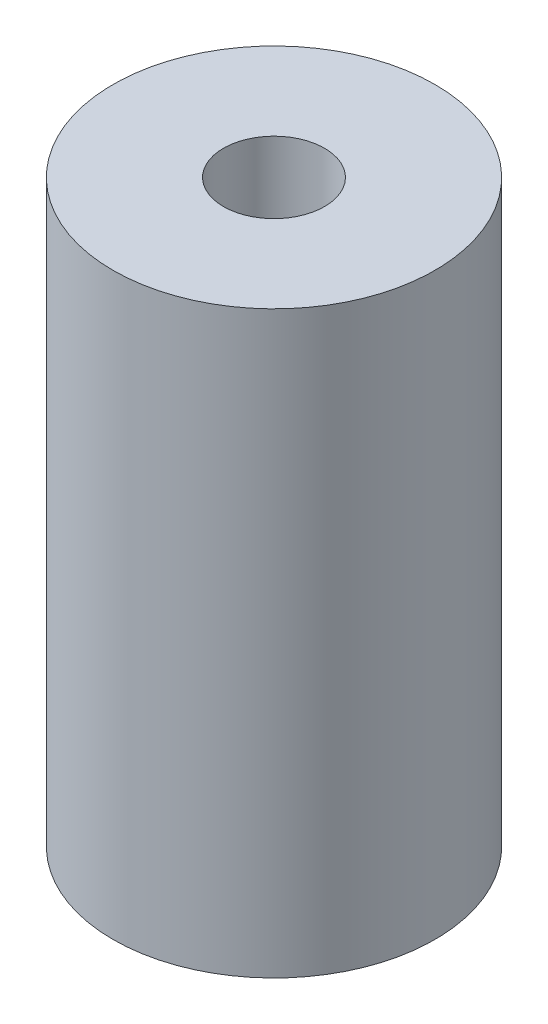
ISO-10303-21;
HEADER;
FILE_DESCRIPTION(('STEP AP214'),'2;1');
FILE_NAME('part.step','',(''),(''),'','','');
FILE_SCHEMA(('AUTOMOTIVE_DESIGN { 1 0 10303 214 1 1 1 1 }'));
ENDSEC;
DATA;
#1=APPLICATION_CONTEXT('core data for automotive mechanical design processes');
#2=APPLICATION_PROTOCOL_DEFINITION('international standard','automotive_design',2000,#1);
#3=PRODUCT_CONTEXT('',#1,'mechanical');
#4=PRODUCT('Part','Part','',(#3));
#5=PRODUCT_RELATED_PRODUCT_CATEGORY('part','',(#4));
#6=PRODUCT_DEFINITION_FORMATION('','',#4);
#7=PRODUCT_DEFINITION_CONTEXT('part definition',#1,'design');
#8=PRODUCT_DEFINITION('design','',#6,#7);
#9=PRODUCT_DEFINITION_SHAPE('','',#8);
#10=(LENGTH_UNIT() NAMED_UNIT(*) SI_UNIT(.MILLI.,.METRE.));
#11=(NAMED_UNIT(*) PLANE_ANGLE_UNIT() SI_UNIT($,.RADIAN.));
#12=(NAMED_UNIT(*) SI_UNIT($,.STERADIAN.) SOLID_ANGLE_UNIT());
#13=UNCERTAINTY_MEASURE_WITH_UNIT(LENGTH_MEASURE(1.E-05),#10,'distance_accuracy_value','');
#14=(GEOMETRIC_REPRESENTATION_CONTEXT(3) GLOBAL_UNCERTAINTY_ASSIGNED_CONTEXT((#13)) GLOBAL_UNIT_ASSIGNED_CONTEXT((#10,
#11,#12)) REPRESENTATION_CONTEXT('',''));
#15=CARTESIAN_POINT('',(0.,0.,0.));
#16=DIRECTION('',(0.,0.,1.));
#17=DIRECTION('',(1.,0.,0.));
#18=AXIS2_PLACEMENT_3D('',#15,#16,#17);
#19=CARTESIAN_POINT('',(0.,11.43,0.));
#20=DIRECTION('',(0.,-1.,0.));
#21=DIRECTION('',(0.,0.,-1.));
#22=AXIS2_PLACEMENT_3D('',#19,#20,#21);
#23=CYLINDRICAL_SURFACE('',#22,3.175);
#24=CARTESIAN_POINT('',(0.,11.43,0.));
#25=DIRECTION('',(0.,1.,0.));
#26=DIRECTION('',(0.,0.,1.));
#27=AXIS2_PLACEMENT_3D('',#24,#25,#26);
#28=CIRCLE('',#27,3.175);
#29=CARTESIAN_POINT('',(0.,11.43,3.175));
#30=VERTEX_POINT('',#29);
#31=EDGE_CURVE('E10',#30,#30,#28,.T.);
#32=ORIENTED_EDGE('',*,*,#31,.F.);
#33=EDGE_LOOP('',(#32));
#34=FACE_BOUND('',#33,.T.);
#35=CARTESIAN_POINT('',(0.,0.,0.));
#36=DIRECTION('',(0.,1.,0.));
#37=DIRECTION('',(0.,0.,1.));
#38=AXIS2_PLACEMENT_3D('',#35,#36,#37);
#39=CIRCLE('',#38,3.175);
#40=CARTESIAN_POINT('',(0.,0.,3.175));
#41=VERTEX_POINT('',#40);
#42=EDGE_CURVE('E34',#41,#41,#39,.T.);
#43=ORIENTED_EDGE('',*,*,#42,.T.);
#44=EDGE_LOOP('',(#43));
#45=FACE_BOUND('',#44,.T.);
#46=ADVANCED_FACE('F31',(#34,#45),#23,.T.);
#47=CARTESIAN_POINT('',(0.,11.43,0.));
#48=DIRECTION('',(0.,1.,0.));
#49=DIRECTION('',(0.,0.,1.));
#50=AXIS2_PLACEMENT_3D('',#47,#48,#49);
#51=PLANE('',#50);
#52=CARTESIAN_POINT('',(0.,11.43,0.));
#53=DIRECTION('',(0.,1.,0.));
#54=DIRECTION('',(0.,0.,1.));
#55=AXIS2_PLACEMENT_3D('',#52,#53,#54);
#56=CIRCLE('',#55,0.996949999999999);
#57=CARTESIAN_POINT('',(0.,11.43,0.996949999999999));
#58=VERTEX_POINT('',#57);
#59=EDGE_CURVE('E45',#58,#58,#56,.T.);
#60=ORIENTED_EDGE('',*,*,#59,.F.);
#61=EDGE_LOOP('',(#60));
#62=FACE_BOUND('',#61,.T.);
#63=ORIENTED_EDGE('',*,*,#31,.T.);
#64=EDGE_LOOP('',(#63));
#65=FACE_BOUND('',#64,.T.);
#66=ADVANCED_FACE('F51',(#62,#65),#51,.T.);
#67=CARTESIAN_POINT('',(0.,0.,0.));
#68=DIRECTION('',(0.,1.,0.));
#69=DIRECTION('',(0.,0.,1.));
#70=AXIS2_PLACEMENT_3D('',#67,#68,#69);
#71=PLANE('',#70);
#72=CARTESIAN_POINT('',(0.,0.,0.));
#73=DIRECTION('',(0.,1.,0.));
#74=DIRECTION('',(0.,0.,1.));
#75=AXIS2_PLACEMENT_3D('',#72,#73,#74);
#76=CIRCLE('',#75,0.996949999999997);
#77=CARTESIAN_POINT('',(0.,0.,0.996949999999997));
#78=VERTEX_POINT('',#77);
#79=EDGE_CURVE('E41',#78,#78,#76,.T.);
#80=ORIENTED_EDGE('',*,*,#79,.T.);
#81=EDGE_LOOP('',(#80));
#82=FACE_BOUND('',#81,.T.);
#83=ORIENTED_EDGE('',*,*,#42,.F.);
#84=EDGE_LOOP('',(#83));
#85=FACE_BOUND('',#84,.T.);
#86=ADVANCED_FACE('F53',(#82,#85),#71,.F.);
#87=CARTESIAN_POINT('',(0.,11.43,0.));
#88=DIRECTION('',(0.,1.,0.));
#89=DIRECTION('',(0.,0.,1.));
#90=AXIS2_PLACEMENT_3D('',#87,#88,#89);
#91=CYLINDRICAL_SURFACE('',#90,0.996949999999998);
#92=ORIENTED_EDGE('',*,*,#79,.F.);
#93=EDGE_LOOP('',(#92));
#94=FACE_BOUND('',#93,.T.);
#95=ORIENTED_EDGE('',*,*,#59,.T.);
#96=EDGE_LOOP('',(#95));
#97=FACE_BOUND('',#96,.T.);
#98=ADVANCED_FACE('F49',(#94,#97),#91,.F.);
#99=CLOSED_SHELL('',(#46,#66,#86,#98));
#100=MANIFOLD_SOLID_BREP('B2',#99);
#101=ADVANCED_BREP_SHAPE_REPRESENTATION('',(#18,#100),#14);
#102=SHAPE_DEFINITION_REPRESENTATION(#9,#101);
ENDSEC;
END-ISO-10303-21;
